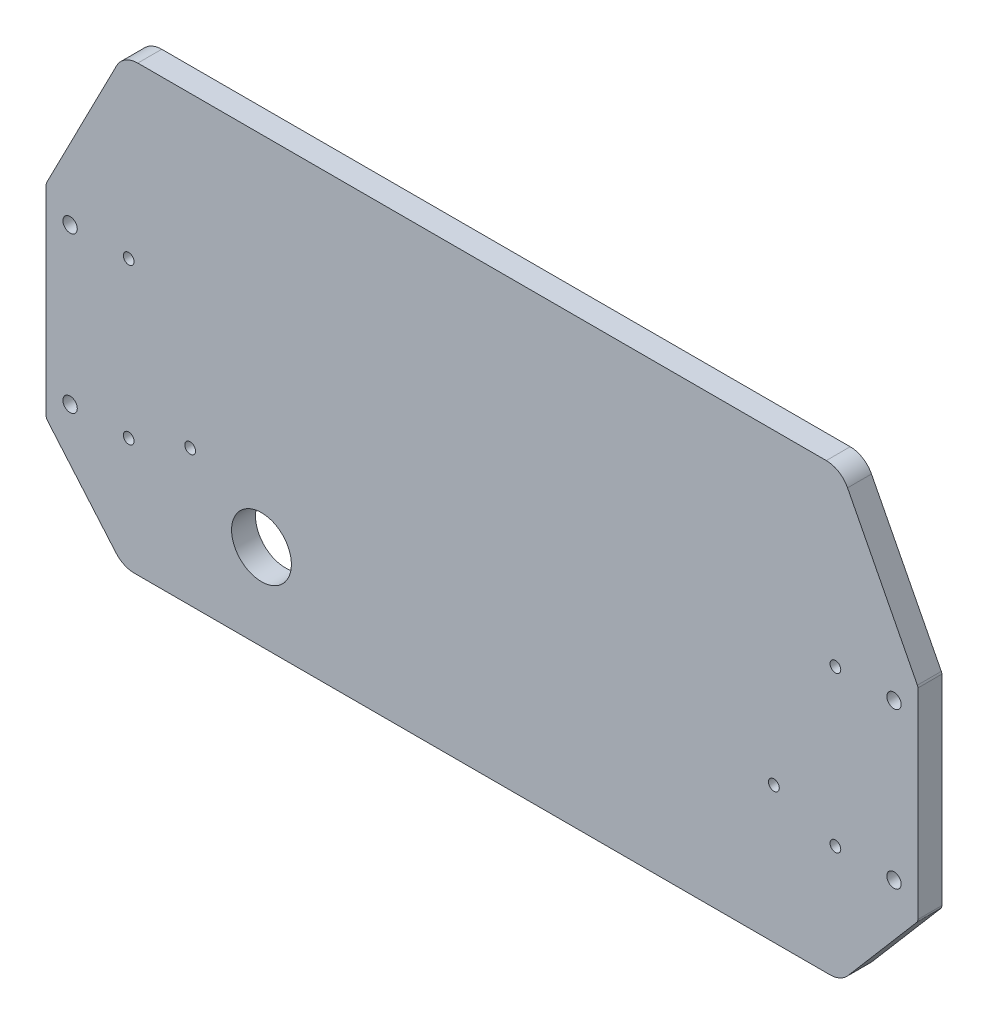
ISO-10303-21;
HEADER;
FILE_DESCRIPTION(('STEP AP214'),'2;1');
FILE_NAME('part.step','',(''),(''),'','','');
FILE_SCHEMA(('AUTOMOTIVE_DESIGN { 1 0 10303 214 1 1 1 1 }'));
ENDSEC;
DATA;
#1=APPLICATION_CONTEXT('core data for automotive mechanical design processes');
#2=APPLICATION_PROTOCOL_DEFINITION('international standard','automotive_design',2000,#1);
#3=PRODUCT_CONTEXT('',#1,'mechanical');
#4=PRODUCT('Part','Part','',(#3));
#5=PRODUCT_RELATED_PRODUCT_CATEGORY('part','',(#4));
#6=PRODUCT_DEFINITION_FORMATION('','',#4);
#7=PRODUCT_DEFINITION_CONTEXT('part definition',#1,'design');
#8=PRODUCT_DEFINITION('design','',#6,#7);
#9=PRODUCT_DEFINITION_SHAPE('','',#8);
#10=(LENGTH_UNIT() NAMED_UNIT(*) SI_UNIT(.MILLI.,.METRE.));
#11=(NAMED_UNIT(*) PLANE_ANGLE_UNIT() SI_UNIT($,.RADIAN.));
#12=(NAMED_UNIT(*) SI_UNIT($,.STERADIAN.) SOLID_ANGLE_UNIT());
#13=UNCERTAINTY_MEASURE_WITH_UNIT(LENGTH_MEASURE(1.E-05),#10,'distance_accuracy_value','');
#14=(GEOMETRIC_REPRESENTATION_CONTEXT(3) GLOBAL_UNCERTAINTY_ASSIGNED_CONTEXT((#13)) GLOBAL_UNIT_ASSIGNED_CONTEXT((#10,
#11,#12)) REPRESENTATION_CONTEXT('',''));
#15=CARTESIAN_POINT('',(0.,0.,0.));
#16=DIRECTION('',(0.,0.,1.));
#17=DIRECTION('',(1.,0.,0.));
#18=AXIS2_PLACEMENT_3D('',#15,#16,#17);
#19=CARTESIAN_POINT('',(0.,-80.2,10.));
#20=DIRECTION('',(0.,1.,0.));
#21=DIRECTION('',(-1.,0.,0.));
#22=AXIS2_PLACEMENT_3D('',#19,#20,#21);
#23=PLANE('',#22);
#24=DIRECTION('',(1.,0.,0.));
#25=VECTOR('',#24,1.);
#26=CARTESIAN_POINT('',(0.,-80.2,0.));
#27=LINE('',#26,#25);
#28=CARTESIAN_POINT('',(-145.390044544516,-80.2,0.));
#29=VERTEX_POINT('',#28);
#30=CARTESIAN_POINT('',(145.390044544516,-80.2,0.));
#31=VERTEX_POINT('',#30);
#32=EDGE_CURVE('E313',#29,#31,#27,.T.);
#33=ORIENTED_EDGE('',*,*,#32,.T.);
#34=DIRECTION('',(0.,0.,-1.));
#35=VECTOR('',#34,1.);
#36=CARTESIAN_POINT('',(145.390044544516,-80.2,10.));
#37=LINE('',#36,#35);
#38=CARTESIAN_POINT('',(145.390044544516,-80.2,10.));
#39=VERTEX_POINT('',#38);
#40=EDGE_CURVE('E234',#31,#39,#37,.F.);
#41=ORIENTED_EDGE('',*,*,#40,.T.);
#42=DIRECTION('',(1.,0.,0.));
#43=VECTOR('',#42,1.);
#44=CARTESIAN_POINT('',(0.,-80.2,10.));
#45=LINE('',#44,#43);
#46=CARTESIAN_POINT('',(-145.390044544516,-80.2,10.));
#47=VERTEX_POINT('',#46);
#48=EDGE_CURVE('E296',#47,#39,#45,.T.);
#49=ORIENTED_EDGE('',*,*,#48,.F.);
#50=DIRECTION('',(0.,0.,-1.));
#51=VECTOR('',#50,1.);
#52=CARTESIAN_POINT('',(-145.390044544516,-80.2,0.));
#53=LINE('',#52,#51);
#54=EDGE_CURVE('E230',#47,#29,#53,.T.);
#55=ORIENTED_EDGE('',*,*,#54,.T.);
#56=EDGE_LOOP('',(#33,#41,#49,#55));
#57=FACE_BOUND('',#56,.T.);
#58=ADVANCED_FACE('F40',(#57),#23,.F.);
#59=CARTESIAN_POINT('',(126.336478542632,-107.905427296359,10.));
#60=DIRECTION('',(0.76039442947789,-0.649461555150876,0.));
#61=DIRECTION('',(0.649461555150876,0.76039442947789,0.));
#62=AXIS2_PLACEMENT_3D('',#59,#60,#61);
#63=PLANE('',#62);
#64=DIRECTION('',(-0.649461555150876,-0.76039442947789,0.));
#65=VECTOR('',#64,1.);
#66=CARTESIAN_POINT('',(126.336478542632,-107.905427296359,0.));
#67=LINE('',#66,#65);
#68=CARTESIAN_POINT('',(181.720788858956,-43.0610639756947,0.));
#69=VERTEX_POINT('',#68);
#70=CARTESIAN_POINT('',(152.993988839295,-76.6946155515087,0.));
#71=VERTEX_POINT('',#70);
#72=EDGE_CURVE('E287',#69,#71,#67,.T.);
#73=ORIENTED_EDGE('',*,*,#72,.F.);
#74=DIRECTION('',(0.,0.,-1.));
#75=VECTOR('',#74,1.);
#76=CARTESIAN_POINT('',(181.720788858956,-43.0610639756947,10.));
#77=LINE('',#76,#75);
#78=CARTESIAN_POINT('',(181.720788858956,-43.0610639756947,10.));
#79=VERTEX_POINT('',#78);
#80=EDGE_CURVE('E49',#69,#79,#77,.F.);
#81=ORIENTED_EDGE('',*,*,#80,.T.);
#82=DIRECTION('',(-0.649461555150876,-0.76039442947789,0.));
#83=VECTOR('',#82,1.);
#84=CARTESIAN_POINT('',(126.336478542632,-107.905427296359,10.));
#85=LINE('',#84,#83);
#86=CARTESIAN_POINT('',(152.993988839295,-76.6946155515087,10.));
#87=VERTEX_POINT('',#86);
#88=EDGE_CURVE('E286',#79,#87,#85,.T.);
#89=ORIENTED_EDGE('',*,*,#88,.T.);
#90=DIRECTION('',(0.,0.,-1.));
#91=VECTOR('',#90,1.);
#92=CARTESIAN_POINT('',(152.993988839295,-76.6946155515088,0.));
#93=LINE('',#92,#91);
#94=EDGE_CURVE('E226',#87,#71,#93,.T.);
#95=ORIENTED_EDGE('',*,*,#94,.T.);
#96=EDGE_LOOP('',(#73,#81,#89,#95));
#97=FACE_BOUND('',#96,.T.);
#98=ADVANCED_FACE('F285',(#97),#63,.T.);
#99=CARTESIAN_POINT('',(182.2,0.,10.));
#100=DIRECTION('',(1.,0.,0.));
#101=DIRECTION('',(0.,0.,-1.));
#102=AXIS2_PLACEMENT_3D('',#99,#100,#101);
#103=PLANE('',#102);
#104=DIRECTION('',(0.,-1.,0.));
#105=VECTOR('',#104,1.);
#106=CARTESIAN_POINT('',(182.2,0.,10.));
#107=LINE('',#106,#105);
#108=CARTESIAN_POINT('',(182.2,42.0164619294803,10.));
#109=VERTEX_POINT('',#108);
#110=CARTESIAN_POINT('',(182.2,-41.7621408653929,10.));
#111=VERTEX_POINT('',#110);
#112=EDGE_CURVE('E295',#109,#111,#107,.T.);
#113=ORIENTED_EDGE('',*,*,#112,.T.);
#114=DIRECTION('',(0.,0.,-1.));
#115=VECTOR('',#114,1.);
#116=CARTESIAN_POINT('',(182.2,-41.7621408653929,10.));
#117=LINE('',#116,#115);
#118=CARTESIAN_POINT('',(182.2,-41.7621408653929,0.));
#119=VERTEX_POINT('',#118);
#120=EDGE_CURVE('E278',#111,#119,#117,.T.);
#121=ORIENTED_EDGE('',*,*,#120,.T.);
#122=DIRECTION('',(0.,-1.,0.));
#123=VECTOR('',#122,1.);
#124=CARTESIAN_POINT('',(182.2,0.,0.));
#125=LINE('',#124,#123);
#126=CARTESIAN_POINT('',(182.2,42.0164619294803,0.));
#127=VERTEX_POINT('',#126);
#128=EDGE_CURVE('E304',#127,#119,#125,.T.);
#129=ORIENTED_EDGE('',*,*,#128,.F.);
#130=DIRECTION('',(0.,0.,-1.));
#131=VECTOR('',#130,1.);
#132=CARTESIAN_POINT('',(182.2,42.0164619294803,10.));
#133=LINE('',#132,#131);
#134=EDGE_CURVE('E275',#127,#109,#133,.F.);
#135=ORIENTED_EDGE('',*,*,#134,.T.);
#136=EDGE_LOOP('',(#113,#121,#129,#135));
#137=FACE_BOUND('',#136,.T.);
#138=ADVANCED_FACE('F303',(#137),#103,.T.);
#139=CARTESIAN_POINT('',(161.446256035973,82.9117933709464,10.));
#140=DIRECTION('',(0.889551436062962,0.456835027770772,0.));
#141=DIRECTION('',(-0.456835027770772,0.889551436062962,0.));
#142=AXIS2_PLACEMENT_3D('',#139,#140,#141);
#143=PLANE('',#142);
#144=DIRECTION('',(0.456835027770772,-0.889551436062962,0.));
#145=VECTOR('',#144,1.);
#146=CARTESIAN_POINT('',(161.446256035973,82.9117933709464,10.));
#147=LINE('',#146,#145);
#148=CARTESIAN_POINT('',(152.789459665994,99.7683502777077,10.));
#149=VERTEX_POINT('',#148);
#150=CARTESIAN_POINT('',(181.979102872126,42.9301319850219,10.));
#151=VERTEX_POINT('',#150);
#152=EDGE_CURVE('E333',#149,#151,#147,.T.);
#153=ORIENTED_EDGE('',*,*,#152,.T.);
#154=DIRECTION('',(0.,0.,-1.));
#155=VECTOR('',#154,1.);
#156=CARTESIAN_POINT('',(181.979102872126,42.9301319850218,10.));
#157=LINE('',#156,#155);
#158=CARTESIAN_POINT('',(181.979102872126,42.9301319850219,0.));
#159=VERTEX_POINT('',#158);
#160=EDGE_CURVE('E11',#151,#159,#157,.T.);
#161=ORIENTED_EDGE('',*,*,#160,.T.);
#162=DIRECTION('',(0.456835027770772,-0.889551436062962,0.));
#163=VECTOR('',#162,1.);
#164=CARTESIAN_POINT('',(161.446256035973,82.9117933709464,0.));
#165=LINE('',#164,#163);
#166=CARTESIAN_POINT('',(152.789459665994,99.7683502777077,0.));
#167=VERTEX_POINT('',#166);
#168=EDGE_CURVE('E308',#167,#159,#165,.T.);
#169=ORIENTED_EDGE('',*,*,#168,.F.);
#170=DIRECTION('',(0.,0.,-1.));
#171=VECTOR('',#170,1.);
#172=CARTESIAN_POINT('',(152.789459665994,99.7683502777078,10.));
#173=LINE('',#172,#171);
#174=EDGE_CURVE('E223',#167,#149,#173,.F.);
#175=ORIENTED_EDGE('',*,*,#174,.T.);
#176=EDGE_LOOP('',(#153,#161,#169,#175));
#177=FACE_BOUND('',#176,.T.);
#178=ADVANCED_FACE('F527',(#177),#143,.T.);
#179=CARTESIAN_POINT('',(0.,105.2,10.));
#180=DIRECTION('',(0.,1.,0.));
#181=DIRECTION('',(0.,0.,1.));
#182=AXIS2_PLACEMENT_3D('',#179,#180,#181);
#183=PLANE('',#182);
#184=DIRECTION('',(1.,0.,0.));
#185=VECTOR('',#184,1.);
#186=CARTESIAN_POINT('',(0.,105.2,0.));
#187=LINE('',#186,#185);
#188=CARTESIAN_POINT('',(-143.893945305364,105.2,0.));
#189=VERTEX_POINT('',#188);
#190=CARTESIAN_POINT('',(143.893945305364,105.2,0.));
#191=VERTEX_POINT('',#190);
#192=EDGE_CURVE('E169',#189,#191,#187,.T.);
#193=ORIENTED_EDGE('',*,*,#192,.F.);
#194=DIRECTION('',(0.,0.,-1.));
#195=VECTOR('',#194,1.);
#196=CARTESIAN_POINT('',(-143.893945305364,105.2,10.));
#197=LINE('',#196,#195);
#198=CARTESIAN_POINT('',(-143.893945305364,105.2,10.));
#199=VERTEX_POINT('',#198);
#200=EDGE_CURVE('E177',#189,#199,#197,.F.);
#201=ORIENTED_EDGE('',*,*,#200,.T.);
#202=DIRECTION('',(1.,0.,0.));
#203=VECTOR('',#202,1.);
#204=CARTESIAN_POINT('',(0.,105.2,10.));
#205=LINE('',#204,#203);
#206=CARTESIAN_POINT('',(143.893945305364,105.2,10.));
#207=VERTEX_POINT('',#206);
#208=EDGE_CURVE('E336',#199,#207,#205,.T.);
#209=ORIENTED_EDGE('',*,*,#208,.T.);
#210=DIRECTION('',(0.,0.,-1.));
#211=VECTOR('',#210,1.);
#212=CARTESIAN_POINT('',(143.893945305364,105.2,10.));
#213=LINE('',#212,#211);
#214=EDGE_CURVE('E179',#207,#191,#213,.T.);
#215=ORIENTED_EDGE('',*,*,#214,.T.);
#216=EDGE_LOOP('',(#193,#201,#209,#215));
#217=FACE_BOUND('',#216,.T.);
#218=ADVANCED_FACE('F532',(#217),#183,.T.);
#219=CARTESIAN_POINT('',(-161.446256035973,82.9117933709464,10.));
#220=DIRECTION('',(-0.889551436062962,0.456835027770772,0.));
#221=DIRECTION('',(-0.456835027770772,-0.889551436062962,0.));
#222=AXIS2_PLACEMENT_3D('',#219,#220,#221);
#223=PLANE('',#222);
#224=DIRECTION('',(0.456835027770772,0.889551436062962,0.));
#225=VECTOR('',#224,1.);
#226=CARTESIAN_POINT('',(-161.446256035973,82.9117933709464,0.));
#227=LINE('',#226,#225);
#228=CARTESIAN_POINT('',(-181.979102872126,42.9301319850219,0.));
#229=VERTEX_POINT('',#228);
#230=CARTESIAN_POINT('',(-152.789459665994,99.7683502777077,0.));
#231=VERTEX_POINT('',#230);
#232=EDGE_CURVE('E155',#229,#231,#227,.T.);
#233=ORIENTED_EDGE('',*,*,#232,.F.);
#234=DIRECTION('',(0.,0.,-1.));
#235=VECTOR('',#234,1.);
#236=CARTESIAN_POINT('',(-181.979102872126,42.9301319850219,10.));
#237=LINE('',#236,#235);
#238=CARTESIAN_POINT('',(-181.979102872126,42.9301319850219,10.));
#239=VERTEX_POINT('',#238);
#240=EDGE_CURVE('E272',#229,#239,#237,.F.);
#241=ORIENTED_EDGE('',*,*,#240,.T.);
#242=DIRECTION('',(0.456835027770772,0.889551436062962,0.));
#243=VECTOR('',#242,1.);
#244=CARTESIAN_POINT('',(-161.446256035973,82.9117933709464,10.));
#245=LINE('',#244,#243);
#246=CARTESIAN_POINT('',(-152.789459665994,99.7683502777077,10.));
#247=VERTEX_POINT('',#246);
#248=EDGE_CURVE('E184',#239,#247,#245,.T.);
#249=ORIENTED_EDGE('',*,*,#248,.T.);
#250=DIRECTION('',(0.,0.,-1.));
#251=VECTOR('',#250,1.);
#252=CARTESIAN_POINT('',(-152.789459665994,99.7683502777077,10.));
#253=LINE('',#252,#251);
#254=EDGE_CURVE('E176',#247,#231,#253,.T.);
#255=ORIENTED_EDGE('',*,*,#254,.T.);
#256=EDGE_LOOP('',(#233,#241,#249,#255));
#257=FACE_BOUND('',#256,.T.);
#258=ADVANCED_FACE('F182',(#257),#223,.T.);
#259=CARTESIAN_POINT('',(-182.2,0.,10.));
#260=DIRECTION('',(1.,0.,0.));
#261=DIRECTION('',(0.,0.,-1.));
#262=AXIS2_PLACEMENT_3D('',#259,#260,#261);
#263=PLANE('',#262);
#264=DIRECTION('',(0.,-1.,0.));
#265=VECTOR('',#264,1.);
#266=CARTESIAN_POINT('',(-182.2,0.,0.));
#267=LINE('',#266,#265);
#268=CARTESIAN_POINT('',(-182.2,42.0164619294803,0.));
#269=VERTEX_POINT('',#268);
#270=CARTESIAN_POINT('',(-182.2,-41.7621408653928,0.));
#271=VERTEX_POINT('',#270);
#272=EDGE_CURVE('E168',#269,#271,#267,.T.);
#273=ORIENTED_EDGE('',*,*,#272,.T.);
#274=DIRECTION('',(0.,0.,-1.));
#275=VECTOR('',#274,1.);
#276=CARTESIAN_POINT('',(-182.2,-41.7621408653928,10.));
#277=LINE('',#276,#275);
#278=CARTESIAN_POINT('',(-182.2,-41.7621408653928,10.));
#279=VERTEX_POINT('',#278);
#280=EDGE_CURVE('E259',#271,#279,#277,.F.);
#281=ORIENTED_EDGE('',*,*,#280,.T.);
#282=DIRECTION('',(0.,-1.,0.));
#283=VECTOR('',#282,1.);
#284=CARTESIAN_POINT('',(-182.2,0.,10.));
#285=LINE('',#284,#283);
#286=CARTESIAN_POINT('',(-182.2,42.0164619294803,10.));
#287=VERTEX_POINT('',#286);
#288=EDGE_CURVE('E195',#287,#279,#285,.T.);
#289=ORIENTED_EDGE('',*,*,#288,.F.);
#290=DIRECTION('',(0.,0.,-1.));
#291=VECTOR('',#290,1.);
#292=CARTESIAN_POINT('',(-182.2,42.0164619294803,0.));
#293=LINE('',#292,#291);
#294=EDGE_CURVE('E255',#287,#269,#293,.T.);
#295=ORIENTED_EDGE('',*,*,#294,.T.);
#296=EDGE_LOOP('',(#273,#281,#289,#295));
#297=FACE_BOUND('',#296,.T.);
#298=ADVANCED_FACE('F537',(#297),#263,.F.);
#299=CARTESIAN_POINT('',(-126.336478542632,-107.905427296359,10.));
#300=DIRECTION('',(-0.760394429477889,-0.649461555150877,0.));
#301=DIRECTION('',(0.649461555150877,-0.760394429477889,0.));
#302=AXIS2_PLACEMENT_3D('',#299,#300,#301);
#303=PLANE('',#302);
#304=DIRECTION('',(-0.649461555150877,0.760394429477889,0.));
#305=VECTOR('',#304,1.);
#306=CARTESIAN_POINT('',(-126.336478542632,-107.905427296359,10.));
#307=LINE('',#306,#305);
#308=CARTESIAN_POINT('',(-152.993988839295,-76.6946155515088,10.));
#309=VERTEX_POINT('',#308);
#310=CARTESIAN_POINT('',(-181.720788858956,-43.0610639756946,10.));
#311=VERTEX_POINT('',#310);
#312=EDGE_CURVE('E188',#309,#311,#307,.T.);
#313=ORIENTED_EDGE('',*,*,#312,.T.);
#314=DIRECTION('',(0.,0.,-1.));
#315=VECTOR('',#314,1.);
#316=CARTESIAN_POINT('',(-181.720788858956,-43.0610639756946,0.));
#317=LINE('',#316,#315);
#318=CARTESIAN_POINT('',(-181.720788858956,-43.0610639756946,0.));
#319=VERTEX_POINT('',#318);
#320=EDGE_CURVE('E240',#311,#319,#317,.T.);
#321=ORIENTED_EDGE('',*,*,#320,.T.);
#322=DIRECTION('',(-0.649461555150877,0.760394429477889,0.));
#323=VECTOR('',#322,1.);
#324=CARTESIAN_POINT('',(-126.336478542632,-107.905427296359,0.));
#325=LINE('',#324,#323);
#326=CARTESIAN_POINT('',(-152.993988839295,-76.6946155515088,0.));
#327=VERTEX_POINT('',#326);
#328=EDGE_CURVE('E198',#327,#319,#325,.T.);
#329=ORIENTED_EDGE('',*,*,#328,.F.);
#330=DIRECTION('',(0.,0.,-1.));
#331=VECTOR('',#330,1.);
#332=CARTESIAN_POINT('',(-152.993988839295,-76.6946155515088,10.));
#333=LINE('',#332,#331);
#334=EDGE_CURVE('E237',#327,#309,#333,.F.);
#335=ORIENTED_EDGE('',*,*,#334,.T.);
#336=EDGE_LOOP('',(#313,#321,#329,#335));
#337=FACE_BOUND('',#336,.T.);
#338=ADVANCED_FACE('F476',(#337),#303,.T.);
#339=CARTESIAN_POINT('',(0.,0.,10.));
#340=DIRECTION('',(0.,0.,1.));
#341=DIRECTION('',(1.,0.,0.));
#342=AXIS2_PLACEMENT_3D('',#339,#340,#341);
#343=PLANE('',#342);
#344=CARTESIAN_POINT('',(-92.2,-44.2,10.));
#345=DIRECTION('',(0.,0.,-1.));
#346=DIRECTION('',(-1.,0.,0.));
#347=AXIS2_PLACEMENT_3D('',#344,#345,#346);
#348=CIRCLE('',#347,12.5);
#349=CARTESIAN_POINT('',(-104.7,-44.2,10.));
#350=VERTEX_POINT('',#349);
#351=EDGE_CURVE('E418',#350,#350,#348,.T.);
#352=ORIENTED_EDGE('',*,*,#351,.T.);
#353=EDGE_LOOP('',(#352));
#354=FACE_BOUND('',#353,.T.);
#355=CARTESIAN_POINT('',(-122.,-23.2,10.));
#356=DIRECTION('',(0.,0.,1.));
#357=DIRECTION('',(1.,0.,0.));
#358=AXIS2_PLACEMENT_3D('',#355,#356,#357);
#359=CIRCLE('',#358,2.25000000000001);
#360=CARTESIAN_POINT('',(-119.75,-23.2,10.));
#361=VERTEX_POINT('',#360);
#362=EDGE_CURVE('E422',#361,#361,#359,.T.);
#363=ORIENTED_EDGE('',*,*,#362,.F.);
#364=EDGE_LOOP('',(#363));
#365=FACE_BOUND('',#364,.T.);
#366=CARTESIAN_POINT('',(122.,-23.2,10.));
#367=DIRECTION('',(0.,0.,1.));
#368=DIRECTION('',(1.,0.,0.));
#369=AXIS2_PLACEMENT_3D('',#366,#367,#368);
#370=CIRCLE('',#369,2.25000000000001);
#371=CARTESIAN_POINT('',(124.25,-23.2,10.));
#372=VERTEX_POINT('',#371);
#373=EDGE_CURVE('E413',#372,#372,#370,.T.);
#374=ORIENTED_EDGE('',*,*,#373,.F.);
#375=EDGE_LOOP('',(#374));
#376=FACE_BOUND('',#375,.T.);
#377=CARTESIAN_POINT('',(-172.2,32.5,10.));
#378=DIRECTION('',(0.,0.,1.));
#379=DIRECTION('',(1.,0.,0.));
#380=AXIS2_PLACEMENT_3D('',#377,#378,#379);
#381=CIRCLE('',#380,2.99999999999999);
#382=CARTESIAN_POINT('',(-169.2,32.5,10.));
#383=VERTEX_POINT('',#382);
#384=EDGE_CURVE('E382',#383,#383,#381,.T.);
#385=ORIENTED_EDGE('',*,*,#384,.F.);
#386=EDGE_LOOP('',(#385));
#387=FACE_BOUND('',#386,.T.);
#388=CARTESIAN_POINT('',(-172.2,-32.5,10.));
#389=DIRECTION('',(0.,0.,1.));
#390=DIRECTION('',(1.,0.,0.));
#391=AXIS2_PLACEMENT_3D('',#388,#389,#390);
#392=CIRCLE('',#391,2.99999999999999);
#393=CARTESIAN_POINT('',(-169.2,-32.5,10.));
#394=VERTEX_POINT('',#393);
#395=EDGE_CURVE('E374',#394,#394,#392,.T.);
#396=ORIENTED_EDGE('',*,*,#395,.F.);
#397=EDGE_LOOP('',(#396));
#398=FACE_BOUND('',#397,.T.);
#399=CARTESIAN_POINT('',(-147.7,-32.5,10.));
#400=DIRECTION('',(0.,0.,1.));
#401=DIRECTION('',(1.,0.,0.));
#402=AXIS2_PLACEMENT_3D('',#399,#400,#401);
#403=CIRCLE('',#402,2.25000000000001);
#404=CARTESIAN_POINT('',(-145.45,-32.5,10.));
#405=VERTEX_POINT('',#404);
#406=EDGE_CURVE('E366',#405,#405,#403,.T.);
#407=ORIENTED_EDGE('',*,*,#406,.F.);
#408=EDGE_LOOP('',(#407));
#409=FACE_BOUND('',#408,.T.);
#410=CARTESIAN_POINT('',(172.2,-32.5,10.));
#411=DIRECTION('',(0.,0.,1.));
#412=DIRECTION('',(1.,0.,0.));
#413=AXIS2_PLACEMENT_3D('',#410,#411,#412);
#414=CIRCLE('',#413,2.99999999999999);
#415=CARTESIAN_POINT('',(175.2,-32.5,10.));
#416=VERTEX_POINT('',#415);
#417=EDGE_CURVE('E357',#416,#416,#414,.T.);
#418=ORIENTED_EDGE('',*,*,#417,.F.);
#419=EDGE_LOOP('',(#418));
#420=FACE_BOUND('',#419,.T.);
#421=CARTESIAN_POINT('',(147.7,32.5,10.));
#422=DIRECTION('',(0.,0.,1.));
#423=DIRECTION('',(1.,0.,0.));
#424=AXIS2_PLACEMENT_3D('',#421,#422,#423);
#425=CIRCLE('',#424,2.25000000000001);
#426=CARTESIAN_POINT('',(149.95,32.5,10.));
#427=VERTEX_POINT('',#426);
#428=EDGE_CURVE('E405',#427,#427,#425,.T.);
#429=ORIENTED_EDGE('',*,*,#428,.F.);
#430=EDGE_LOOP('',(#429));
#431=FACE_BOUND('',#430,.T.);
#432=CARTESIAN_POINT('',(172.2,32.5,10.));
#433=DIRECTION('',(0.,0.,1.));
#434=DIRECTION('',(1.,0.,0.));
#435=AXIS2_PLACEMENT_3D('',#432,#433,#434);
#436=CIRCLE('',#435,2.99999999999997);
#437=CARTESIAN_POINT('',(175.2,32.5,10.));
#438=VERTEX_POINT('',#437);
#439=EDGE_CURVE('E389',#438,#438,#436,.T.);
#440=ORIENTED_EDGE('',*,*,#439,.F.);
#441=EDGE_LOOP('',(#440));
#442=FACE_BOUND('',#441,.T.);
#443=CARTESIAN_POINT('',(147.7,-32.5,10.));
#444=DIRECTION('',(0.,0.,1.));
#445=DIRECTION('',(1.,0.,0.));
#446=AXIS2_PLACEMENT_3D('',#443,#444,#445);
#447=CIRCLE('',#446,2.25000000000001);
#448=CARTESIAN_POINT('',(149.95,-32.5,10.));
#449=VERTEX_POINT('',#448);
#450=EDGE_CURVE('E398',#449,#449,#447,.T.);
#451=ORIENTED_EDGE('',*,*,#450,.F.);
#452=EDGE_LOOP('',(#451));
#453=FACE_BOUND('',#452,.T.);
#454=CARTESIAN_POINT('',(-147.7,32.5,10.));
#455=DIRECTION('',(0.,0.,1.));
#456=DIRECTION('',(1.,0.,0.));
#457=AXIS2_PLACEMENT_3D('',#454,#455,#456);
#458=CIRCLE('',#457,2.25000000000001);
#459=CARTESIAN_POINT('',(-145.45,32.5,10.));
#460=VERTEX_POINT('',#459);
#461=EDGE_CURVE('E328',#460,#460,#458,.T.);
#462=ORIENTED_EDGE('',*,*,#461,.F.);
#463=EDGE_LOOP('',(#462));
#464=FACE_BOUND('',#463,.T.);
#465=ORIENTED_EDGE('',*,*,#288,.T.);
#466=CARTESIAN_POINT('',(-180.2,-41.7621408653928,10.));
#467=DIRECTION('',(0.,0.,1.));
#468=DIRECTION('',(1.,0.,0.));
#469=AXIS2_PLACEMENT_3D('',#466,#467,#468);
#470=CIRCLE('',#469,2.);
#471=EDGE_CURVE('E269',#279,#311,#470,.T.);
#472=ORIENTED_EDGE('',*,*,#471,.T.);
#473=ORIENTED_EDGE('',*,*,#312,.F.);
#474=CARTESIAN_POINT('',(-145.390044544516,-70.2,10.));
#475=DIRECTION('',(0.,0.,1.));
#476=DIRECTION('',(1.,0.,0.));
#477=AXIS2_PLACEMENT_3D('',#474,#475,#476);
#478=CIRCLE('',#477,10.);
#479=EDGE_CURVE('E210',#309,#47,#478,.T.);
#480=ORIENTED_EDGE('',*,*,#479,.T.);
#481=ORIENTED_EDGE('',*,*,#48,.T.);
#482=CARTESIAN_POINT('',(145.390044544516,-70.2,10.));
#483=DIRECTION('',(0.,0.,1.));
#484=DIRECTION('',(1.,0.,0.));
#485=AXIS2_PLACEMENT_3D('',#482,#483,#484);
#486=CIRCLE('',#485,10.);
#487=EDGE_CURVE('E213',#39,#87,#486,.T.);
#488=ORIENTED_EDGE('',*,*,#487,.T.);
#489=ORIENTED_EDGE('',*,*,#88,.F.);
#490=CARTESIAN_POINT('',(180.2,-41.7621408653929,10.));
#491=DIRECTION('',(0.,0.,1.));
#492=DIRECTION('',(1.,0.,0.));
#493=AXIS2_PLACEMENT_3D('',#490,#491,#492);
#494=CIRCLE('',#493,2.);
#495=EDGE_CURVE('E62',#79,#111,#494,.T.);
#496=ORIENTED_EDGE('',*,*,#495,.T.);
#497=ORIENTED_EDGE('',*,*,#112,.F.);
#498=CARTESIAN_POINT('',(180.2,42.0164619294803,10.));
#499=DIRECTION('',(0.,0.,1.));
#500=DIRECTION('',(1.,0.,0.));
#501=AXIS2_PLACEMENT_3D('',#498,#499,#500);
#502=CIRCLE('',#501,2.);
#503=EDGE_CURVE('E56',#109,#151,#502,.T.);
#504=ORIENTED_EDGE('',*,*,#503,.T.);
#505=ORIENTED_EDGE('',*,*,#152,.F.);
#506=CARTESIAN_POINT('',(143.893945305364,95.2,10.));
#507=DIRECTION('',(0.,0.,1.));
#508=DIRECTION('',(1.,0.,0.));
#509=AXIS2_PLACEMENT_3D('',#506,#507,#508);
#510=CIRCLE('',#509,10.);
#511=EDGE_CURVE('E217',#149,#207,#510,.T.);
#512=ORIENTED_EDGE('',*,*,#511,.T.);
#513=ORIENTED_EDGE('',*,*,#208,.F.);
#514=CARTESIAN_POINT('',(-143.893945305364,95.2,10.));
#515=DIRECTION('',(0.,0.,1.));
#516=DIRECTION('',(1.,0.,0.));
#517=AXIS2_PLACEMENT_3D('',#514,#515,#516);
#518=CIRCLE('',#517,10.);
#519=EDGE_CURVE('E220',#199,#247,#518,.T.);
#520=ORIENTED_EDGE('',*,*,#519,.T.);
#521=ORIENTED_EDGE('',*,*,#248,.F.);
#522=CARTESIAN_POINT('',(-180.2,42.0164619294803,10.));
#523=DIRECTION('',(0.,0.,1.));
#524=DIRECTION('',(1.,0.,0.));
#525=AXIS2_PLACEMENT_3D('',#522,#523,#524);
#526=CIRCLE('',#525,2.);
#527=EDGE_CURVE('E266',#239,#287,#526,.T.);
#528=ORIENTED_EDGE('',*,*,#527,.T.);
#529=EDGE_LOOP('',(#465,#472,#473,#480,#481,#488,#489,#496,#497,#504,#505,#512,#513,#520,#521,#528));
#530=FACE_BOUND('',#529,.T.);
#531=ADVANCED_FACE('F290',(#354,#365,#376,#387,#398,#409,#420,#431,#442,#453,#464,#530),#343,.T.);
#532=CARTESIAN_POINT('',(0.,0.,0.));
#533=DIRECTION('',(0.,0.,1.));
#534=DIRECTION('',(1.,0.,0.));
#535=AXIS2_PLACEMENT_3D('',#532,#533,#534);
#536=PLANE('',#535);
#537=CARTESIAN_POINT('',(-92.2,-44.2,0.));
#538=DIRECTION('',(0.,0.,-1.));
#539=DIRECTION('',(-1.,0.,0.));
#540=AXIS2_PLACEMENT_3D('',#537,#538,#539);
#541=CIRCLE('',#540,12.5);
#542=CARTESIAN_POINT('',(-104.7,-44.2,0.));
#543=VERTEX_POINT('',#542);
#544=EDGE_CURVE('E429',#543,#543,#541,.T.);
#545=ORIENTED_EDGE('',*,*,#544,.F.);
#546=EDGE_LOOP('',(#545));
#547=FACE_BOUND('',#546,.T.);
#548=CARTESIAN_POINT('',(-122.,-23.2,0.));
#549=DIRECTION('',(0.,0.,1.));
#550=DIRECTION('',(1.,0.,0.));
#551=AXIS2_PLACEMENT_3D('',#548,#549,#550);
#552=CIRCLE('',#551,2.25000000000001);
#553=CARTESIAN_POINT('',(-119.75,-23.2,0.));
#554=VERTEX_POINT('',#553);
#555=EDGE_CURVE('E409',#554,#554,#552,.T.);
#556=ORIENTED_EDGE('',*,*,#555,.T.);
#557=EDGE_LOOP('',(#556));
#558=FACE_BOUND('',#557,.T.);
#559=CARTESIAN_POINT('',(122.,-23.2,0.));
#560=DIRECTION('',(0.,0.,1.));
#561=DIRECTION('',(1.,0.,0.));
#562=AXIS2_PLACEMENT_3D('',#559,#560,#561);
#563=CIRCLE('',#562,2.25000000000001);
#564=CARTESIAN_POINT('',(124.25,-23.2,0.));
#565=VERTEX_POINT('',#564);
#566=EDGE_CURVE('E417',#565,#565,#563,.T.);
#567=ORIENTED_EDGE('',*,*,#566,.T.);
#568=EDGE_LOOP('',(#567));
#569=FACE_BOUND('',#568,.T.);
#570=CARTESIAN_POINT('',(-172.2,32.5,0.));
#571=DIRECTION('',(0.,0.,1.));
#572=DIRECTION('',(1.,0.,0.));
#573=AXIS2_PLACEMENT_3D('',#570,#571,#572);
#574=CIRCLE('',#573,2.99999999999999);
#575=CARTESIAN_POINT('',(-169.2,32.5,0.));
#576=VERTEX_POINT('',#575);
#577=EDGE_CURVE('E355',#576,#576,#574,.T.);
#578=ORIENTED_EDGE('',*,*,#577,.T.);
#579=EDGE_LOOP('',(#578));
#580=FACE_BOUND('',#579,.T.);
#581=CARTESIAN_POINT('',(-172.2,-32.5,0.));
#582=DIRECTION('',(0.,0.,1.));
#583=DIRECTION('',(1.,0.,0.));
#584=AXIS2_PLACEMENT_3D('',#581,#582,#583);
#585=CIRCLE('',#584,2.99999999999999);
#586=CARTESIAN_POINT('',(-169.2,-32.5,0.));
#587=VERTEX_POINT('',#586);
#588=EDGE_CURVE('E378',#587,#587,#585,.T.);
#589=ORIENTED_EDGE('',*,*,#588,.T.);
#590=EDGE_LOOP('',(#589));
#591=FACE_BOUND('',#590,.T.);
#592=CARTESIAN_POINT('',(-147.7,-32.5,0.));
#593=DIRECTION('',(0.,0.,1.));
#594=DIRECTION('',(1.,0.,0.));
#595=AXIS2_PLACEMENT_3D('',#592,#593,#594);
#596=CIRCLE('',#595,2.25000000000001);
#597=CARTESIAN_POINT('',(-145.45,-32.5,0.));
#598=VERTEX_POINT('',#597);
#599=EDGE_CURVE('E370',#598,#598,#596,.T.);
#600=ORIENTED_EDGE('',*,*,#599,.T.);
#601=EDGE_LOOP('',(#600));
#602=FACE_BOUND('',#601,.T.);
#603=CARTESIAN_POINT('',(172.2,-32.5,0.));
#604=DIRECTION('',(0.,0.,1.));
#605=DIRECTION('',(1.,0.,0.));
#606=AXIS2_PLACEMENT_3D('',#603,#604,#605);
#607=CIRCLE('',#606,2.99999999999999);
#608=CARTESIAN_POINT('',(175.2,-32.5,0.));
#609=VERTEX_POINT('',#608);
#610=EDGE_CURVE('E361',#609,#609,#607,.T.);
#611=ORIENTED_EDGE('',*,*,#610,.T.);
#612=EDGE_LOOP('',(#611));
#613=FACE_BOUND('',#612,.T.);
#614=CARTESIAN_POINT('',(147.7,32.5,0.));
#615=DIRECTION('',(0.,0.,1.));
#616=DIRECTION('',(1.,0.,0.));
#617=AXIS2_PLACEMENT_3D('',#614,#615,#616);
#618=CIRCLE('',#617,2.25000000000001);
#619=CARTESIAN_POINT('',(149.95,32.5,0.));
#620=VERTEX_POINT('',#619);
#621=EDGE_CURVE('E394',#620,#620,#618,.T.);
#622=ORIENTED_EDGE('',*,*,#621,.T.);
#623=EDGE_LOOP('',(#622));
#624=FACE_BOUND('',#623,.T.);
#625=CARTESIAN_POINT('',(172.2,32.5,0.));
#626=DIRECTION('',(0.,0.,1.));
#627=DIRECTION('',(1.,0.,0.));
#628=AXIS2_PLACEMENT_3D('',#625,#626,#627);
#629=CIRCLE('',#628,2.99999999999997);
#630=CARTESIAN_POINT('',(175.2,32.5,0.));
#631=VERTEX_POINT('',#630);
#632=EDGE_CURVE('E393',#631,#631,#629,.T.);
#633=ORIENTED_EDGE('',*,*,#632,.T.);
#634=EDGE_LOOP('',(#633));
#635=FACE_BOUND('',#634,.T.);
#636=CARTESIAN_POINT('',(147.7,-32.5,0.));
#637=DIRECTION('',(0.,0.,1.));
#638=DIRECTION('',(1.,0.,0.));
#639=AXIS2_PLACEMENT_3D('',#636,#637,#638);
#640=CIRCLE('',#639,2.25000000000001);
#641=CARTESIAN_POINT('',(149.95,-32.5,0.));
#642=VERTEX_POINT('',#641);
#643=EDGE_CURVE('E362',#642,#642,#640,.T.);
#644=ORIENTED_EDGE('',*,*,#643,.T.);
#645=EDGE_LOOP('',(#644));
#646=FACE_BOUND('',#645,.T.);
#647=CARTESIAN_POINT('',(-147.7,32.5,0.));
#648=DIRECTION('',(0.,0.,1.));
#649=DIRECTION('',(1.,0.,0.));
#650=AXIS2_PLACEMENT_3D('',#647,#648,#649);
#651=CIRCLE('',#650,2.25000000000001);
#652=CARTESIAN_POINT('',(-145.45,32.5,0.));
#653=VERTEX_POINT('',#652);
#654=EDGE_CURVE('E345',#653,#653,#651,.T.);
#655=ORIENTED_EDGE('',*,*,#654,.T.);
#656=EDGE_LOOP('',(#655));
#657=FACE_BOUND('',#656,.T.);
#658=ORIENTED_EDGE('',*,*,#328,.T.);
#659=CARTESIAN_POINT('',(-180.2,-41.7621408653928,0.));
#660=DIRECTION('',(0.,0.,1.));
#661=DIRECTION('',(1.,0.,0.));
#662=AXIS2_PLACEMENT_3D('',#659,#660,#661);
#663=CIRCLE('',#662,2.);
#664=EDGE_CURVE('E252',#319,#271,#663,.F.);
#665=ORIENTED_EDGE('',*,*,#664,.T.);
#666=ORIENTED_EDGE('',*,*,#272,.F.);
#667=CARTESIAN_POINT('',(-180.2,42.0164619294803,0.));
#668=DIRECTION('',(0.,0.,1.));
#669=DIRECTION('',(1.,0.,0.));
#670=AXIS2_PLACEMENT_3D('',#667,#668,#669);
#671=CIRCLE('',#670,2.);
#672=EDGE_CURVE('E163',#269,#229,#671,.F.);
#673=ORIENTED_EDGE('',*,*,#672,.T.);
#674=ORIENTED_EDGE('',*,*,#232,.T.);
#675=CARTESIAN_POINT('',(-143.893945305364,95.2,0.));
#676=DIRECTION('',(0.,0.,1.));
#677=DIRECTION('',(1.,0.,0.));
#678=AXIS2_PLACEMENT_3D('',#675,#676,#677);
#679=CIRCLE('',#678,10.);
#680=EDGE_CURVE('E160',#231,#189,#679,.F.);
#681=ORIENTED_EDGE('',*,*,#680,.T.);
#682=ORIENTED_EDGE('',*,*,#192,.T.);
#683=CARTESIAN_POINT('',(143.893945305364,95.2,0.));
#684=DIRECTION('',(0.,0.,1.));
#685=DIRECTION('',(1.,0.,0.));
#686=AXIS2_PLACEMENT_3D('',#683,#684,#685);
#687=CIRCLE('',#686,10.);
#688=EDGE_CURVE('E180',#191,#167,#687,.F.);
#689=ORIENTED_EDGE('',*,*,#688,.T.);
#690=ORIENTED_EDGE('',*,*,#168,.T.);
#691=CARTESIAN_POINT('',(180.2,42.0164619294803,0.));
#692=DIRECTION('',(0.,0.,1.));
#693=DIRECTION('',(1.,0.,0.));
#694=AXIS2_PLACEMENT_3D('',#691,#692,#693);
#695=CIRCLE('',#694,2.);
#696=EDGE_CURVE('E244',#159,#127,#695,.F.);
#697=ORIENTED_EDGE('',*,*,#696,.T.);
#698=ORIENTED_EDGE('',*,*,#128,.T.);
#699=CARTESIAN_POINT('',(180.2,-41.7621408653929,0.));
#700=DIRECTION('',(0.,0.,1.));
#701=DIRECTION('',(1.,0.,0.));
#702=AXIS2_PLACEMENT_3D('',#699,#700,#701);
#703=CIRCLE('',#702,2.);
#704=EDGE_CURVE('E247',#119,#69,#703,.F.);
#705=ORIENTED_EDGE('',*,*,#704,.T.);
#706=ORIENTED_EDGE('',*,*,#72,.T.);
#707=CARTESIAN_POINT('',(145.390044544516,-70.2,0.));
#708=DIRECTION('',(0.,0.,1.));
#709=DIRECTION('',(1.,0.,0.));
#710=AXIS2_PLACEMENT_3D('',#707,#708,#709);
#711=CIRCLE('',#710,10.);
#712=EDGE_CURVE('E192',#71,#31,#711,.F.);
#713=ORIENTED_EDGE('',*,*,#712,.T.);
#714=ORIENTED_EDGE('',*,*,#32,.F.);
#715=CARTESIAN_POINT('',(-145.390044544516,-70.2,0.));
#716=DIRECTION('',(0.,0.,1.));
#717=DIRECTION('',(1.,0.,0.));
#718=AXIS2_PLACEMENT_3D('',#715,#716,#717);
#719=CIRCLE('',#718,10.);
#720=EDGE_CURVE('E187',#29,#327,#719,.F.);
#721=ORIENTED_EDGE('',*,*,#720,.T.);
#722=EDGE_LOOP('',(#658,#665,#666,#673,#674,#681,#682,#689,#690,#697,#698,#705,#706,#713,#714,#721));
#723=FACE_BOUND('',#722,.T.);
#724=ADVANCED_FACE('F158',(#547,#558,#569,#580,#591,#602,#613,#624,#635,#646,#657,#723),#536,.F.);
#725=CARTESIAN_POINT('',(-147.7,32.5,0.));
#726=DIRECTION('',(0.,0.,1.));
#727=DIRECTION('',(1.,0.,0.));
#728=AXIS2_PLACEMENT_3D('',#725,#726,#727);
#729=CYLINDRICAL_SURFACE('',#728,2.25000000000001);
#730=ORIENTED_EDGE('',*,*,#654,.F.);
#731=EDGE_LOOP('',(#730));
#732=FACE_BOUND('',#731,.T.);
#733=ORIENTED_EDGE('',*,*,#461,.T.);
#734=EDGE_LOOP('',(#733));
#735=FACE_BOUND('',#734,.T.);
#736=ADVANCED_FACE('F447',(#732,#735),#729,.F.);
#737=CARTESIAN_POINT('',(147.7,-32.5,0.));
#738=DIRECTION('',(0.,0.,1.));
#739=DIRECTION('',(1.,0.,0.));
#740=AXIS2_PLACEMENT_3D('',#737,#738,#739);
#741=CYLINDRICAL_SURFACE('',#740,2.25000000000001);
#742=ORIENTED_EDGE('',*,*,#643,.F.);
#743=EDGE_LOOP('',(#742));
#744=FACE_BOUND('',#743,.T.);
#745=ORIENTED_EDGE('',*,*,#450,.T.);
#746=EDGE_LOOP('',(#745));
#747=FACE_BOUND('',#746,.T.);
#748=ADVANCED_FACE('F467',(#744,#747),#741,.F.);
#749=CARTESIAN_POINT('',(172.2,32.5,0.));
#750=DIRECTION('',(0.,0.,1.));
#751=DIRECTION('',(1.,0.,0.));
#752=AXIS2_PLACEMENT_3D('',#749,#750,#751);
#753=CYLINDRICAL_SURFACE('',#752,2.99999999999997);
#754=ORIENTED_EDGE('',*,*,#632,.F.);
#755=EDGE_LOOP('',(#754));
#756=FACE_BOUND('',#755,.T.);
#757=ORIENTED_EDGE('',*,*,#439,.T.);
#758=EDGE_LOOP('',(#757));
#759=FACE_BOUND('',#758,.T.);
#760=ADVANCED_FACE('F470',(#756,#759),#753,.F.);
#761=CARTESIAN_POINT('',(147.7,32.5,0.));
#762=DIRECTION('',(0.,0.,1.));
#763=DIRECTION('',(1.,0.,0.));
#764=AXIS2_PLACEMENT_3D('',#761,#762,#763);
#765=CYLINDRICAL_SURFACE('',#764,2.25000000000001);
#766=ORIENTED_EDGE('',*,*,#621,.F.);
#767=EDGE_LOOP('',(#766));
#768=FACE_BOUND('',#767,.T.);
#769=ORIENTED_EDGE('',*,*,#428,.T.);
#770=EDGE_LOOP('',(#769));
#771=FACE_BOUND('',#770,.T.);
#772=ADVANCED_FACE('F644',(#768,#771),#765,.F.);
#773=CARTESIAN_POINT('',(172.2,-32.5,0.));
#774=DIRECTION('',(0.,0.,1.));
#775=DIRECTION('',(1.,0.,0.));
#776=AXIS2_PLACEMENT_3D('',#773,#774,#775);
#777=CYLINDRICAL_SURFACE('',#776,2.99999999999999);
#778=ORIENTED_EDGE('',*,*,#610,.F.);
#779=EDGE_LOOP('',(#778));
#780=FACE_BOUND('',#779,.T.);
#781=ORIENTED_EDGE('',*,*,#417,.T.);
#782=EDGE_LOOP('',(#781));
#783=FACE_BOUND('',#782,.T.);
#784=ADVANCED_FACE('F653',(#780,#783),#777,.F.);
#785=CARTESIAN_POINT('',(-147.7,-32.5,0.));
#786=DIRECTION('',(0.,0.,1.));
#787=DIRECTION('',(1.,0.,0.));
#788=AXIS2_PLACEMENT_3D('',#785,#786,#787);
#789=CYLINDRICAL_SURFACE('',#788,2.25000000000001);
#790=ORIENTED_EDGE('',*,*,#599,.F.);
#791=EDGE_LOOP('',(#790));
#792=FACE_BOUND('',#791,.T.);
#793=ORIENTED_EDGE('',*,*,#406,.T.);
#794=EDGE_LOOP('',(#793));
#795=FACE_BOUND('',#794,.T.);
#796=ADVANCED_FACE('F662',(#792,#795),#789,.F.);
#797=CARTESIAN_POINT('',(-172.2,-32.5,0.));
#798=DIRECTION('',(0.,0.,1.));
#799=DIRECTION('',(1.,0.,0.));
#800=AXIS2_PLACEMENT_3D('',#797,#798,#799);
#801=CYLINDRICAL_SURFACE('',#800,2.99999999999999);
#802=ORIENTED_EDGE('',*,*,#588,.F.);
#803=EDGE_LOOP('',(#802));
#804=FACE_BOUND('',#803,.T.);
#805=ORIENTED_EDGE('',*,*,#395,.T.);
#806=EDGE_LOOP('',(#805));
#807=FACE_BOUND('',#806,.T.);
#808=ADVANCED_FACE('F670',(#804,#807),#801,.F.);
#809=CARTESIAN_POINT('',(-172.2,32.5,0.));
#810=DIRECTION('',(0.,0.,1.));
#811=DIRECTION('',(1.,0.,0.));
#812=AXIS2_PLACEMENT_3D('',#809,#810,#811);
#813=CYLINDRICAL_SURFACE('',#812,2.99999999999999);
#814=ORIENTED_EDGE('',*,*,#577,.F.);
#815=EDGE_LOOP('',(#814));
#816=FACE_BOUND('',#815,.T.);
#817=ORIENTED_EDGE('',*,*,#384,.T.);
#818=EDGE_LOOP('',(#817));
#819=FACE_BOUND('',#818,.T.);
#820=ADVANCED_FACE('F679',(#816,#819),#813,.F.);
#821=CARTESIAN_POINT('',(122.,-23.2,0.));
#822=DIRECTION('',(0.,0.,1.));
#823=DIRECTION('',(1.,0.,0.));
#824=AXIS2_PLACEMENT_3D('',#821,#822,#823);
#825=CYLINDRICAL_SURFACE('',#824,2.25000000000001);
#826=ORIENTED_EDGE('',*,*,#566,.F.);
#827=EDGE_LOOP('',(#826));
#828=FACE_BOUND('',#827,.T.);
#829=ORIENTED_EDGE('',*,*,#373,.T.);
#830=EDGE_LOOP('',(#829));
#831=FACE_BOUND('',#830,.T.);
#832=ADVANCED_FACE('F688',(#828,#831),#825,.F.);
#833=CARTESIAN_POINT('',(-122.,-23.2,0.));
#834=DIRECTION('',(0.,0.,1.));
#835=DIRECTION('',(1.,0.,0.));
#836=AXIS2_PLACEMENT_3D('',#833,#834,#835);
#837=CYLINDRICAL_SURFACE('',#836,2.25000000000001);
#838=ORIENTED_EDGE('',*,*,#555,.F.);
#839=EDGE_LOOP('',(#838));
#840=FACE_BOUND('',#839,.T.);
#841=ORIENTED_EDGE('',*,*,#362,.T.);
#842=EDGE_LOOP('',(#841));
#843=FACE_BOUND('',#842,.T.);
#844=ADVANCED_FACE('F498',(#840,#843),#837,.F.);
#845=CARTESIAN_POINT('',(-143.893945305364,95.2,10.));
#846=DIRECTION('',(0.,0.,-1.));
#847=DIRECTION('',(-1.,0.,0.));
#848=AXIS2_PLACEMENT_3D('',#845,#846,#847);
#849=CYLINDRICAL_SURFACE('',#848,10.);
#850=ORIENTED_EDGE('',*,*,#519,.F.);
#851=ORIENTED_EDGE('',*,*,#200,.F.);
#852=ORIENTED_EDGE('',*,*,#680,.F.);
#853=ORIENTED_EDGE('',*,*,#254,.F.);
#854=EDGE_LOOP('',(#850,#851,#852,#853));
#855=FACE_BOUND('',#854,.T.);
#856=ADVANCED_FACE('F175',(#855),#849,.T.);
#857=CARTESIAN_POINT('',(143.893945305364,95.2,10.));
#858=DIRECTION('',(0.,0.,-1.));
#859=DIRECTION('',(-1.,0.,0.));
#860=AXIS2_PLACEMENT_3D('',#857,#858,#859);
#861=CYLINDRICAL_SURFACE('',#860,10.);
#862=ORIENTED_EDGE('',*,*,#511,.F.);
#863=ORIENTED_EDGE('',*,*,#174,.F.);
#864=ORIENTED_EDGE('',*,*,#688,.F.);
#865=ORIENTED_EDGE('',*,*,#214,.F.);
#866=EDGE_LOOP('',(#862,#863,#864,#865));
#867=FACE_BOUND('',#866,.T.);
#868=ADVANCED_FACE('F497',(#867),#861,.T.);
#869=CARTESIAN_POINT('',(145.390044544516,-70.2,10.));
#870=DIRECTION('',(0.,0.,1.));
#871=DIRECTION('',(1.,0.,0.));
#872=AXIS2_PLACEMENT_3D('',#869,#870,#871);
#873=CYLINDRICAL_SURFACE('',#872,10.);
#874=ORIENTED_EDGE('',*,*,#487,.F.);
#875=ORIENTED_EDGE('',*,*,#40,.F.);
#876=ORIENTED_EDGE('',*,*,#712,.F.);
#877=ORIENTED_EDGE('',*,*,#94,.F.);
#878=EDGE_LOOP('',(#874,#875,#876,#877));
#879=FACE_BOUND('',#878,.T.);
#880=ADVANCED_FACE('F501',(#879),#873,.T.);
#881=CARTESIAN_POINT('',(-145.390044544516,-70.2,10.));
#882=DIRECTION('',(0.,0.,1.));
#883=DIRECTION('',(1.,0.,0.));
#884=AXIS2_PLACEMENT_3D('',#881,#882,#883);
#885=CYLINDRICAL_SURFACE('',#884,10.);
#886=ORIENTED_EDGE('',*,*,#479,.F.);
#887=ORIENTED_EDGE('',*,*,#334,.F.);
#888=ORIENTED_EDGE('',*,*,#720,.F.);
#889=ORIENTED_EDGE('',*,*,#54,.F.);
#890=EDGE_LOOP('',(#886,#887,#888,#889));
#891=FACE_BOUND('',#890,.T.);
#892=ADVANCED_FACE('F505',(#891),#885,.T.);
#893=CARTESIAN_POINT('',(-180.2,-41.7621408653928,10.));
#894=DIRECTION('',(0.,0.,1.));
#895=DIRECTION('',(1.,0.,0.));
#896=AXIS2_PLACEMENT_3D('',#893,#894,#895);
#897=CYLINDRICAL_SURFACE('',#896,2.);
#898=ORIENTED_EDGE('',*,*,#471,.F.);
#899=ORIENTED_EDGE('',*,*,#280,.F.);
#900=ORIENTED_EDGE('',*,*,#664,.F.);
#901=ORIENTED_EDGE('',*,*,#320,.F.);
#902=EDGE_LOOP('',(#898,#899,#900,#901));
#903=FACE_BOUND('',#902,.T.);
#904=ADVANCED_FACE('F509',(#903),#897,.T.);
#905=CARTESIAN_POINT('',(-180.2,42.0164619294803,10.));
#906=DIRECTION('',(0.,0.,1.));
#907=DIRECTION('',(1.,0.,0.));
#908=AXIS2_PLACEMENT_3D('',#905,#906,#907);
#909=CYLINDRICAL_SURFACE('',#908,2.);
#910=ORIENTED_EDGE('',*,*,#527,.F.);
#911=ORIENTED_EDGE('',*,*,#240,.F.);
#912=ORIENTED_EDGE('',*,*,#672,.F.);
#913=ORIENTED_EDGE('',*,*,#294,.F.);
#914=EDGE_LOOP('',(#910,#911,#912,#913));
#915=FACE_BOUND('',#914,.T.);
#916=ADVANCED_FACE('F513',(#915),#909,.T.);
#917=CARTESIAN_POINT('',(180.2,-41.7621408653929,10.));
#918=DIRECTION('',(0.,0.,-1.));
#919=DIRECTION('',(-1.,0.,0.));
#920=AXIS2_PLACEMENT_3D('',#917,#918,#919);
#921=CYLINDRICAL_SURFACE('',#920,2.);
#922=ORIENTED_EDGE('',*,*,#495,.F.);
#923=ORIENTED_EDGE('',*,*,#80,.F.);
#924=ORIENTED_EDGE('',*,*,#704,.F.);
#925=ORIENTED_EDGE('',*,*,#120,.F.);
#926=EDGE_LOOP('',(#922,#923,#924,#925));
#927=FACE_BOUND('',#926,.T.);
#928=ADVANCED_FACE('F299',(#927),#921,.T.);
#929=CARTESIAN_POINT('',(180.2,42.0164619294803,10.));
#930=DIRECTION('',(0.,0.,-1.));
#931=DIRECTION('',(-1.,0.,0.));
#932=AXIS2_PLACEMENT_3D('',#929,#930,#931);
#933=CYLINDRICAL_SURFACE('',#932,2.);
#934=ORIENTED_EDGE('',*,*,#503,.F.);
#935=ORIENTED_EDGE('',*,*,#134,.F.);
#936=ORIENTED_EDGE('',*,*,#696,.F.);
#937=ORIENTED_EDGE('',*,*,#160,.F.);
#938=EDGE_LOOP('',(#934,#935,#936,#937));
#939=FACE_BOUND('',#938,.T.);
#940=ADVANCED_FACE('F42',(#939),#933,.T.);
#941=CARTESIAN_POINT('',(-92.2,-44.2,10.));
#942=DIRECTION('',(0.,0.,-1.));
#943=DIRECTION('',(-1.,0.,0.));
#944=AXIS2_PLACEMENT_3D('',#941,#942,#943);
#945=CYLINDRICAL_SURFACE('',#944,12.5);
#946=ORIENTED_EDGE('',*,*,#351,.F.);
#947=EDGE_LOOP('',(#946));
#948=FACE_BOUND('',#947,.T.);
#949=ORIENTED_EDGE('',*,*,#544,.T.);
#950=EDGE_LOOP('',(#949));
#951=FACE_BOUND('',#950,.T.);
#952=ADVANCED_FACE('F439',(#948,#951),#945,.F.);
#953=CLOSED_SHELL('',(#58,#98,#138,#178,#218,#258,#298,#338,#531,#724,#736,#748,#760,#772,#784,
#796,#808,#820,#832,#844,#856,#868,#880,#892,#904,#916,#928,#940,#952));
#954=MANIFOLD_SOLID_BREP('B2',#953);
#955=ADVANCED_BREP_SHAPE_REPRESENTATION('',(#18,#954),#14);
#956=SHAPE_DEFINITION_REPRESENTATION(#9,#955);
ENDSEC;
END-ISO-10303-21;
